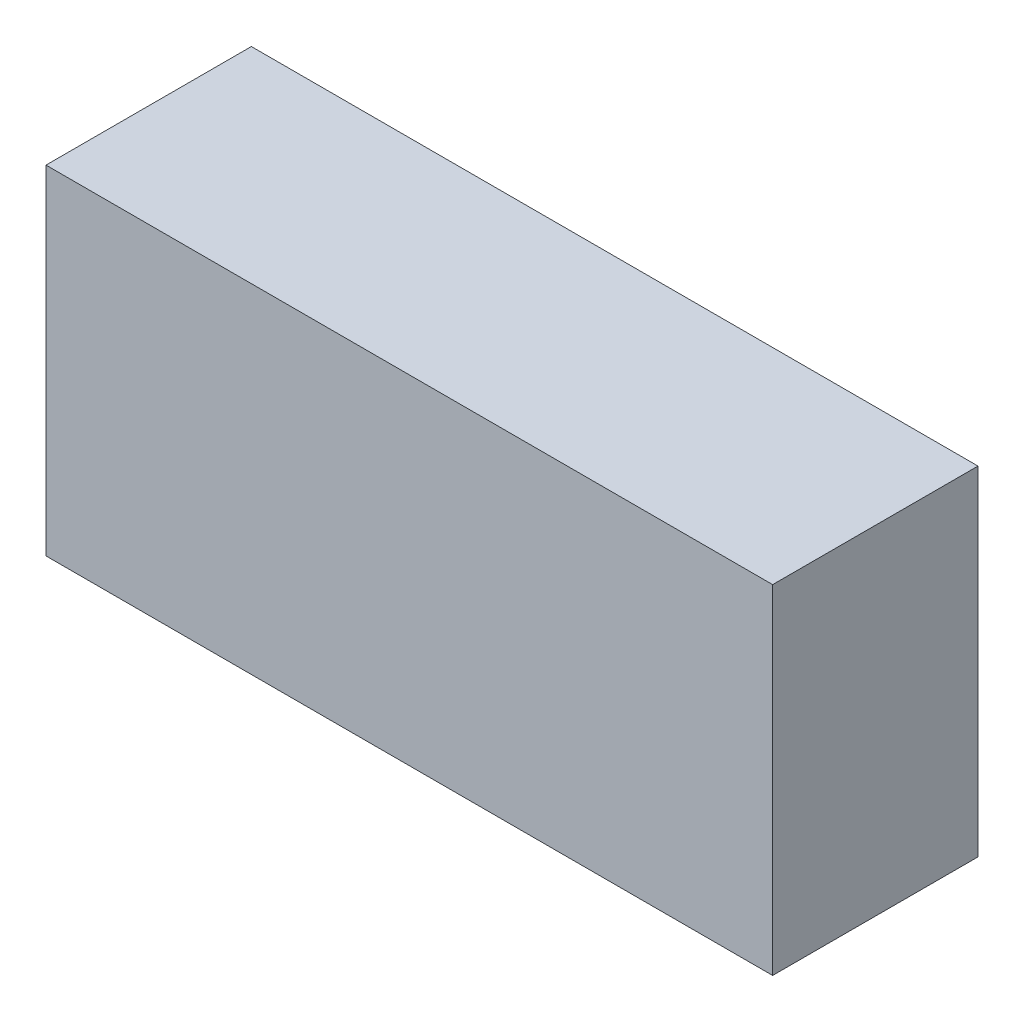
ISO-10303-21;
HEADER;
FILE_DESCRIPTION(('STEP AP214'),'2;1');
FILE_NAME('part.step','',(''),(''),'','','');
FILE_SCHEMA(('AUTOMOTIVE_DESIGN { 1 0 10303 214 1 1 1 1 }'));
ENDSEC;
DATA;
#1=APPLICATION_CONTEXT('core data for automotive mechanical design processes');
#2=APPLICATION_PROTOCOL_DEFINITION('international standard','automotive_design',2000,#1);
#3=PRODUCT_CONTEXT('',#1,'mechanical');
#4=PRODUCT('Part','Part','',(#3));
#5=PRODUCT_RELATED_PRODUCT_CATEGORY('part','',(#4));
#6=PRODUCT_DEFINITION_FORMATION('','',#4);
#7=PRODUCT_DEFINITION_CONTEXT('part definition',#1,'design');
#8=PRODUCT_DEFINITION('design','',#6,#7);
#9=PRODUCT_DEFINITION_SHAPE('','',#8);
#10=(LENGTH_UNIT() NAMED_UNIT(*) SI_UNIT(.MILLI.,.METRE.));
#11=(NAMED_UNIT(*) PLANE_ANGLE_UNIT() SI_UNIT($,.RADIAN.));
#12=(NAMED_UNIT(*) SI_UNIT($,.STERADIAN.) SOLID_ANGLE_UNIT());
#13=UNCERTAINTY_MEASURE_WITH_UNIT(LENGTH_MEASURE(1.E-05),#10,'distance_accuracy_value','');
#14=(GEOMETRIC_REPRESENTATION_CONTEXT(3) GLOBAL_UNCERTAINTY_ASSIGNED_CONTEXT((#13)) GLOBAL_UNIT_ASSIGNED_CONTEXT((#10,
#11,#12)) REPRESENTATION_CONTEXT('',''));
#15=CARTESIAN_POINT('',(0.,0.,0.));
#16=DIRECTION('',(0.,0.,1.));
#17=DIRECTION('',(1.,0.,0.));
#18=AXIS2_PLACEMENT_3D('',#15,#16,#17);
#19=CARTESIAN_POINT('',(16.1,15.,4.55));
#20=DIRECTION('',(-1.,0.,0.));
#21=DIRECTION('',(0.,0.,1.));
#22=AXIS2_PLACEMENT_3D('',#19,#20,#21);
#23=PLANE('',#22);
#24=DIRECTION('',(0.,0.,-1.));
#25=VECTOR('',#24,1.);
#26=CARTESIAN_POINT('',(16.1,0.,4.55));
#27=LINE('',#26,#25);
#28=CARTESIAN_POINT('',(16.1,0.,4.55));
#29=VERTEX_POINT('',#28);
#30=CARTESIAN_POINT('',(16.1,0.,-4.55));
#31=VERTEX_POINT('',#30);
#32=EDGE_CURVE('E95',#29,#31,#27,.T.);
#33=ORIENTED_EDGE('',*,*,#32,.T.);
#34=DIRECTION('',(0.,-1.,0.));
#35=VECTOR('',#34,1.);
#36=CARTESIAN_POINT('',(16.1,15.,-4.55));
#37=LINE('',#36,#35);
#38=CARTESIAN_POINT('',(16.1,15.,-4.55));
#39=VERTEX_POINT('',#38);
#40=EDGE_CURVE('E11',#39,#31,#37,.T.);
#41=ORIENTED_EDGE('',*,*,#40,.F.);
#42=DIRECTION('',(0.,0.,-1.));
#43=VECTOR('',#42,1.);
#44=CARTESIAN_POINT('',(16.1,15.,4.55));
#45=LINE('',#44,#43);
#46=CARTESIAN_POINT('',(16.1,15.,4.55));
#47=VERTEX_POINT('',#46);
#48=EDGE_CURVE('E83',#47,#39,#45,.T.);
#49=ORIENTED_EDGE('',*,*,#48,.F.);
#50=DIRECTION('',(0.,-1.,0.));
#51=VECTOR('',#50,1.);
#52=CARTESIAN_POINT('',(16.1,15.,4.55));
#53=LINE('',#52,#51);
#54=EDGE_CURVE('E91',#47,#29,#53,.T.);
#55=ORIENTED_EDGE('',*,*,#54,.T.);
#56=EDGE_LOOP('',(#33,#41,#49,#55));
#57=FACE_BOUND('',#56,.T.);
#58=ADVANCED_FACE('F32',(#57),#23,.F.);
#59=CARTESIAN_POINT('',(-16.1,15.,-4.55));
#60=DIRECTION('',(0.,0.,1.));
#61=DIRECTION('',(1.,0.,0.));
#62=AXIS2_PLACEMENT_3D('',#59,#60,#61);
#63=PLANE('',#62);
#64=DIRECTION('',(-1.,0.,0.));
#65=VECTOR('',#64,1.);
#66=CARTESIAN_POINT('',(-16.1,0.,-4.55));
#67=LINE('',#66,#65);
#68=CARTESIAN_POINT('',(-16.1,0.,-4.55));
#69=VERTEX_POINT('',#68);
#70=EDGE_CURVE('E87',#31,#69,#67,.T.);
#71=ORIENTED_EDGE('',*,*,#70,.T.);
#72=DIRECTION('',(0.,-1.,0.));
#73=VECTOR('',#72,1.);
#74=CARTESIAN_POINT('',(-16.1,15.,-4.55));
#75=LINE('',#74,#73);
#76=CARTESIAN_POINT('',(-16.1,15.,-4.55));
#77=VERTEX_POINT('',#76);
#78=EDGE_CURVE('E40',#77,#69,#75,.T.);
#79=ORIENTED_EDGE('',*,*,#78,.F.);
#80=DIRECTION('',(-1.,0.,0.));
#81=VECTOR('',#80,1.);
#82=CARTESIAN_POINT('',(-16.1,15.,-4.55));
#83=LINE('',#82,#81);
#84=EDGE_CURVE('E78',#39,#77,#83,.T.);
#85=ORIENTED_EDGE('',*,*,#84,.F.);
#86=ORIENTED_EDGE('',*,*,#40,.T.);
#87=EDGE_LOOP('',(#71,#79,#85,#86));
#88=FACE_BOUND('',#87,.T.);
#89=ADVANCED_FACE('F86',(#88),#63,.F.);
#90=CARTESIAN_POINT('',(-16.1,15.,4.55));
#91=DIRECTION('',(1.,0.,0.));
#92=DIRECTION('',(0.,0.,-1.));
#93=AXIS2_PLACEMENT_3D('',#90,#91,#92);
#94=PLANE('',#93);
#95=DIRECTION('',(0.,0.,1.));
#96=VECTOR('',#95,1.);
#97=CARTESIAN_POINT('',(-16.1,0.,4.55));
#98=LINE('',#97,#96);
#99=CARTESIAN_POINT('',(-16.1,0.,4.55));
#100=VERTEX_POINT('',#99);
#101=EDGE_CURVE('E65',#69,#100,#98,.T.);
#102=ORIENTED_EDGE('',*,*,#101,.T.);
#103=DIRECTION('',(0.,-1.,0.));
#104=VECTOR('',#103,1.);
#105=CARTESIAN_POINT('',(-16.1,15.,4.55));
#106=LINE('',#105,#104);
#107=CARTESIAN_POINT('',(-16.1,15.,4.55));
#108=VERTEX_POINT('',#107);
#109=EDGE_CURVE('E88',#108,#100,#106,.T.);
#110=ORIENTED_EDGE('',*,*,#109,.F.);
#111=DIRECTION('',(0.,0.,1.));
#112=VECTOR('',#111,1.);
#113=CARTESIAN_POINT('',(-16.1,15.,4.55));
#114=LINE('',#113,#112);
#115=EDGE_CURVE('E81',#77,#108,#114,.T.);
#116=ORIENTED_EDGE('',*,*,#115,.F.);
#117=ORIENTED_EDGE('',*,*,#78,.T.);
#118=EDGE_LOOP('',(#102,#110,#116,#117));
#119=FACE_BOUND('',#118,.T.);
#120=ADVANCED_FACE('F89',(#119),#94,.F.);
#121=CARTESIAN_POINT('',(-16.1,15.,4.55));
#122=DIRECTION('',(0.,0.,-1.));
#123=DIRECTION('',(-1.,0.,0.));
#124=AXIS2_PLACEMENT_3D('',#121,#122,#123);
#125=PLANE('',#124);
#126=DIRECTION('',(1.,0.,0.));
#127=VECTOR('',#126,1.);
#128=CARTESIAN_POINT('',(-16.1,0.,4.55));
#129=LINE('',#128,#127);
#130=EDGE_CURVE('E71',#100,#29,#129,.T.);
#131=ORIENTED_EDGE('',*,*,#130,.T.);
#132=ORIENTED_EDGE('',*,*,#54,.F.);
#133=DIRECTION('',(1.,0.,0.));
#134=VECTOR('',#133,1.);
#135=CARTESIAN_POINT('',(-16.1,15.,4.55));
#136=LINE('',#135,#134);
#137=EDGE_CURVE('E48',#108,#47,#136,.T.);
#138=ORIENTED_EDGE('',*,*,#137,.F.);
#139=ORIENTED_EDGE('',*,*,#109,.T.);
#140=EDGE_LOOP('',(#131,#132,#138,#139));
#141=FACE_BOUND('',#140,.T.);
#142=ADVANCED_FACE('F102',(#141),#125,.F.);
#143=CARTESIAN_POINT('',(0.,15.,0.));
#144=DIRECTION('',(0.,-1.,0.));
#145=DIRECTION('',(0.,0.,-1.));
#146=AXIS2_PLACEMENT_3D('',#143,#144,#145);
#147=PLANE('',#146);
#148=ORIENTED_EDGE('',*,*,#48,.T.);
#149=ORIENTED_EDGE('',*,*,#84,.T.);
#150=ORIENTED_EDGE('',*,*,#115,.T.);
#151=ORIENTED_EDGE('',*,*,#137,.T.);
#152=EDGE_LOOP('',(#148,#149,#150,#151));
#153=FACE_BOUND('',#152,.T.);
#154=ADVANCED_FACE('F79',(#153),#147,.F.);
#155=CARTESIAN_POINT('',(0.,0.,0.));
#156=DIRECTION('',(0.,-1.,0.));
#157=DIRECTION('',(0.,0.,-1.));
#158=AXIS2_PLACEMENT_3D('',#155,#156,#157);
#159=PLANE('',#158);
#160=ORIENTED_EDGE('',*,*,#32,.F.);
#161=ORIENTED_EDGE('',*,*,#130,.F.);
#162=ORIENTED_EDGE('',*,*,#101,.F.);
#163=ORIENTED_EDGE('',*,*,#70,.F.);
#164=EDGE_LOOP('',(#160,#161,#162,#163));
#165=FACE_BOUND('',#164,.T.);
#166=ADVANCED_FACE('F105',(#165),#159,.T.);
#167=CLOSED_SHELL('',(#58,#89,#120,#142,#154,#166));
#168=MANIFOLD_SOLID_BREP('B2',#167);
#169=ADVANCED_BREP_SHAPE_REPRESENTATION('',(#18,#168),#14);
#170=SHAPE_DEFINITION_REPRESENTATION(#9,#169);
ENDSEC;
END-ISO-10303-21;
